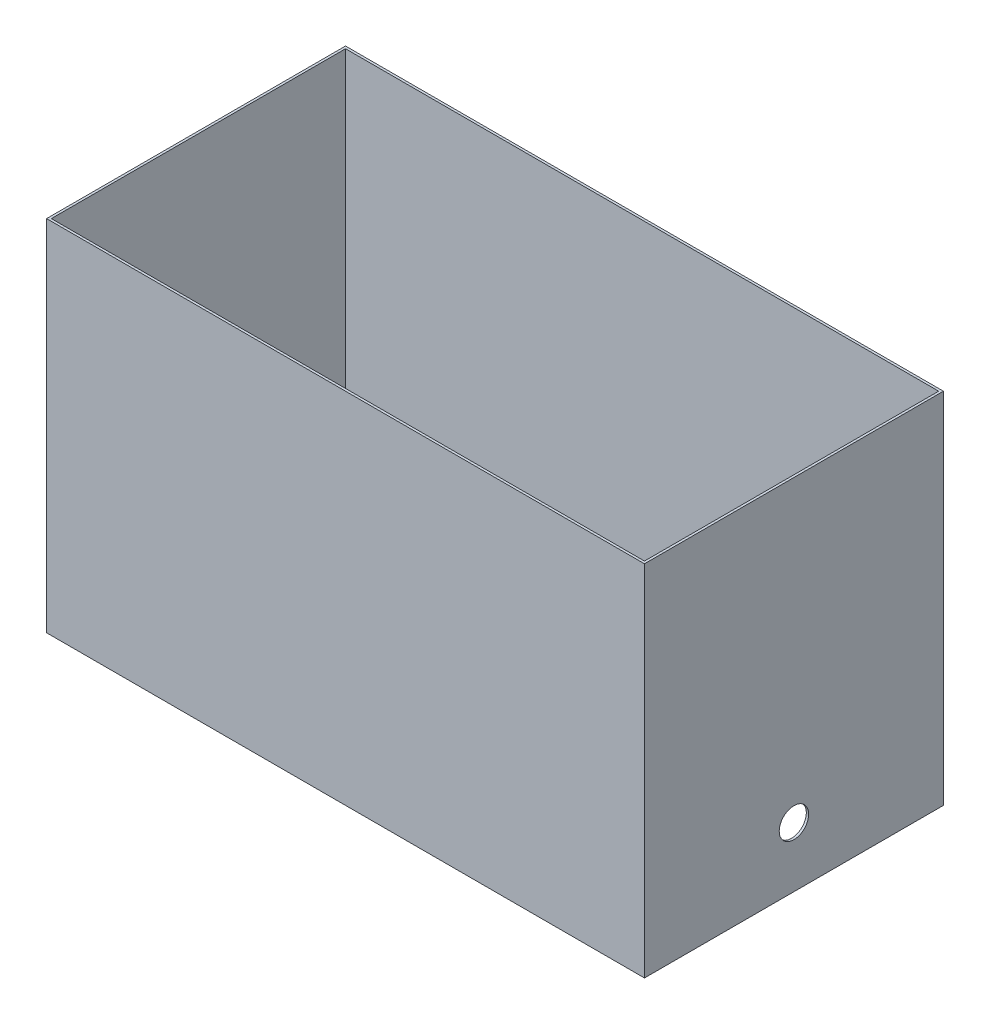
ISO-10303-21;
HEADER;
FILE_DESCRIPTION(('STEP AP214'),'2;1');
FILE_NAME('part.step','',(''),(''),'','','');
FILE_SCHEMA(('AUTOMOTIVE_DESIGN { 1 0 10303 214 1 1 1 1 }'));
ENDSEC;
DATA;
#1=APPLICATION_CONTEXT('core data for automotive mechanical design processes');
#2=APPLICATION_PROTOCOL_DEFINITION('international standard','automotive_design',2000,#1);
#3=PRODUCT_CONTEXT('',#1,'mechanical');
#4=PRODUCT('Part','Part','',(#3));
#5=PRODUCT_RELATED_PRODUCT_CATEGORY('part','',(#4));
#6=PRODUCT_DEFINITION_FORMATION('','',#4);
#7=PRODUCT_DEFINITION_CONTEXT('part definition',#1,'design');
#8=PRODUCT_DEFINITION('design','',#6,#7);
#9=PRODUCT_DEFINITION_SHAPE('','',#8);
#10=(LENGTH_UNIT() NAMED_UNIT(*) SI_UNIT(.MILLI.,.METRE.));
#11=(NAMED_UNIT(*) PLANE_ANGLE_UNIT() SI_UNIT($,.RADIAN.));
#12=(NAMED_UNIT(*) SI_UNIT($,.STERADIAN.) SOLID_ANGLE_UNIT());
#13=UNCERTAINTY_MEASURE_WITH_UNIT(LENGTH_MEASURE(1.E-05),#10,'distance_accuracy_value','');
#14=(GEOMETRIC_REPRESENTATION_CONTEXT(3) GLOBAL_UNCERTAINTY_ASSIGNED_CONTEXT((#13)) GLOBAL_UNIT_ASSIGNED_CONTEXT((#10,
#11,#12)) REPRESENTATION_CONTEXT('',''));
#15=CARTESIAN_POINT('',(0.,0.,0.));
#16=DIRECTION('',(0.,0.,1.));
#17=DIRECTION('',(1.,0.,0.));
#18=AXIS2_PLACEMENT_3D('',#15,#16,#17);
#19=CARTESIAN_POINT('',(0.,304.8,0.));
#20=DIRECTION('',(0.,-1.,0.));
#21=DIRECTION('',(0.,0.,-1.));
#22=AXIS2_PLACEMENT_3D('',#19,#20,#21);
#23=PLANE('',#22);
#24=DIRECTION('',(0.,0.,-1.));
#25=VECTOR('',#24,1.);
#26=CARTESIAN_POINT('',(254.,304.8,127.));
#27=LINE('',#26,#25);
#28=CARTESIAN_POINT('',(254.,304.8,127.));
#29=VERTEX_POINT('',#28);
#30=CARTESIAN_POINT('',(254.,304.8,-127.));
#31=VERTEX_POINT('',#30);
#32=EDGE_CURVE('E136',#29,#31,#27,.T.);
#33=ORIENTED_EDGE('',*,*,#32,.T.);
#34=DIRECTION('',(-1.,0.,0.));
#35=VECTOR('',#34,1.);
#36=CARTESIAN_POINT('',(-254.,304.8,-127.));
#37=LINE('',#36,#35);
#38=CARTESIAN_POINT('',(-254.,304.8,-127.));
#39=VERTEX_POINT('',#38);
#40=EDGE_CURVE('E139',#31,#39,#37,.T.);
#41=ORIENTED_EDGE('',*,*,#40,.T.);
#42=DIRECTION('',(0.,0.,1.));
#43=VECTOR('',#42,1.);
#44=CARTESIAN_POINT('',(-254.,304.8,127.));
#45=LINE('',#44,#43);
#46=CARTESIAN_POINT('',(-254.,304.8,127.));
#47=VERTEX_POINT('',#46);
#48=EDGE_CURVE('E142',#39,#47,#45,.T.);
#49=ORIENTED_EDGE('',*,*,#48,.T.);
#50=DIRECTION('',(1.,0.,0.));
#51=VECTOR('',#50,1.);
#52=CARTESIAN_POINT('',(-254.,304.8,127.));
#53=LINE('',#52,#51);
#54=EDGE_CURVE('E144',#47,#29,#53,.T.);
#55=ORIENTED_EDGE('',*,*,#54,.T.);
#56=EDGE_LOOP('',(#33,#41,#49,#55));
#57=FACE_BOUND('',#56,.T.);
#58=DIRECTION('',(0.,0.,1.));
#59=VECTOR('',#58,1.);
#60=CARTESIAN_POINT('',(-252.,304.8,125.));
#61=LINE('',#60,#59);
#62=CARTESIAN_POINT('',(-252.,304.8,-125.));
#63=VERTEX_POINT('',#62);
#64=CARTESIAN_POINT('',(-252.,304.8,125.));
#65=VERTEX_POINT('',#64);
#66=EDGE_CURVE('E98',#63,#65,#61,.T.);
#67=ORIENTED_EDGE('',*,*,#66,.F.);
#68=DIRECTION('',(-1.,0.,0.));
#69=VECTOR('',#68,1.);
#70=CARTESIAN_POINT('',(-252.,304.8,-125.));
#71=LINE('',#70,#69);
#72=CARTESIAN_POINT('',(252.,304.8,-125.));
#73=VERTEX_POINT('',#72);
#74=EDGE_CURVE('E120',#73,#63,#71,.T.);
#75=ORIENTED_EDGE('',*,*,#74,.F.);
#76=DIRECTION('',(0.,0.,-1.));
#77=VECTOR('',#76,1.);
#78=CARTESIAN_POINT('',(252.,304.8,125.));
#79=LINE('',#78,#77);
#80=CARTESIAN_POINT('',(252.,304.8,125.));
#81=VERTEX_POINT('',#80);
#82=EDGE_CURVE('E118',#81,#73,#79,.T.);
#83=ORIENTED_EDGE('',*,*,#82,.F.);
#84=DIRECTION('',(1.,0.,0.));
#85=VECTOR('',#84,1.);
#86=CARTESIAN_POINT('',(-252.,304.8,125.));
#87=LINE('',#86,#85);
#88=EDGE_CURVE('E106',#65,#81,#87,.T.);
#89=ORIENTED_EDGE('',*,*,#88,.F.);
#90=EDGE_LOOP('',(#67,#75,#83,#89));
#91=FACE_BOUND('',#90,.T.);
#92=ADVANCED_FACE('F32',(#57,#91),#23,.F.);
#93=CARTESIAN_POINT('',(0.,0.,0.));
#94=DIRECTION('',(0.,-1.,0.));
#95=DIRECTION('',(0.,0.,-1.));
#96=AXIS2_PLACEMENT_3D('',#93,#94,#95);
#97=PLANE('',#96);
#98=DIRECTION('',(0.,0.,-1.));
#99=VECTOR('',#98,1.);
#100=CARTESIAN_POINT('',(254.,0.,127.));
#101=LINE('',#100,#99);
#102=CARTESIAN_POINT('',(254.,0.,127.));
#103=VERTEX_POINT('',#102);
#104=CARTESIAN_POINT('',(254.,0.,-127.));
#105=VERTEX_POINT('',#104);
#106=EDGE_CURVE('E114',#103,#105,#101,.T.);
#107=ORIENTED_EDGE('',*,*,#106,.F.);
#108=DIRECTION('',(1.,0.,0.));
#109=VECTOR('',#108,1.);
#110=CARTESIAN_POINT('',(-254.,0.,127.));
#111=LINE('',#110,#109);
#112=CARTESIAN_POINT('',(-254.,0.,127.));
#113=VERTEX_POINT('',#112);
#114=EDGE_CURVE('E140',#113,#103,#111,.T.);
#115=ORIENTED_EDGE('',*,*,#114,.F.);
#116=DIRECTION('',(0.,0.,1.));
#117=VECTOR('',#116,1.);
#118=CARTESIAN_POINT('',(-254.,0.,127.));
#119=LINE('',#118,#117);
#120=CARTESIAN_POINT('',(-254.,0.,-127.));
#121=VERTEX_POINT('',#120);
#122=EDGE_CURVE('E151',#121,#113,#119,.T.);
#123=ORIENTED_EDGE('',*,*,#122,.F.);
#124=DIRECTION('',(-1.,0.,0.));
#125=VECTOR('',#124,1.);
#126=CARTESIAN_POINT('',(-254.,0.,-127.));
#127=LINE('',#126,#125);
#128=EDGE_CURVE('E149',#105,#121,#127,.T.);
#129=ORIENTED_EDGE('',*,*,#128,.F.);
#130=EDGE_LOOP('',(#107,#115,#123,#129));
#131=FACE_BOUND('',#130,.T.);
#132=DIRECTION('',(-1.,0.,0.));
#133=VECTOR('',#132,1.);
#134=CARTESIAN_POINT('',(-252.,0.,-125.));
#135=LINE('',#134,#133);
#136=CARTESIAN_POINT('',(252.,0.,-125.));
#137=VERTEX_POINT('',#136);
#138=CARTESIAN_POINT('',(-252.,0.,-125.));
#139=VERTEX_POINT('',#138);
#140=EDGE_CURVE('E107',#137,#139,#135,.T.);
#141=ORIENTED_EDGE('',*,*,#140,.T.);
#142=DIRECTION('',(0.,0.,1.));
#143=VECTOR('',#142,1.);
#144=CARTESIAN_POINT('',(-252.,0.,125.));
#145=LINE('',#144,#143);
#146=CARTESIAN_POINT('',(-252.,0.,125.));
#147=VERTEX_POINT('',#146);
#148=EDGE_CURVE('E56',#139,#147,#145,.T.);
#149=ORIENTED_EDGE('',*,*,#148,.T.);
#150=DIRECTION('',(1.,0.,0.));
#151=VECTOR('',#150,1.);
#152=CARTESIAN_POINT('',(-252.,0.,125.));
#153=LINE('',#152,#151);
#154=CARTESIAN_POINT('',(252.,0.,125.));
#155=VERTEX_POINT('',#154);
#156=EDGE_CURVE('E113',#147,#155,#153,.T.);
#157=ORIENTED_EDGE('',*,*,#156,.T.);
#158=DIRECTION('',(0.,0.,-1.));
#159=VECTOR('',#158,1.);
#160=CARTESIAN_POINT('',(252.,0.,125.));
#161=LINE('',#160,#159);
#162=EDGE_CURVE('E128',#155,#137,#161,.T.);
#163=ORIENTED_EDGE('',*,*,#162,.T.);
#164=EDGE_LOOP('',(#141,#149,#157,#163));
#165=FACE_BOUND('',#164,.T.);
#166=ADVANCED_FACE('F170',(#131,#165),#97,.T.);
#167=CARTESIAN_POINT('',(254.,304.8,127.));
#168=DIRECTION('',(-1.,0.,0.));
#169=DIRECTION('',(0.,0.,1.));
#170=AXIS2_PLACEMENT_3D('',#167,#168,#169);
#171=PLANE('',#170);
#172=CARTESIAN_POINT('',(254.,50.8,0.));
#173=DIRECTION('',(-1.,0.,0.));
#174=DIRECTION('',(0.,0.,1.));
#175=AXIS2_PLACEMENT_3D('',#172,#173,#174);
#176=CIRCLE('',#175,12.5);
#177=CARTESIAN_POINT('',(254.,50.8,12.5));
#178=VERTEX_POINT('',#177);
#179=EDGE_CURVE('E211',#178,#178,#176,.T.);
#180=ORIENTED_EDGE('',*,*,#179,.T.);
#181=EDGE_LOOP('',(#180));
#182=FACE_BOUND('',#181,.T.);
#183=ORIENTED_EDGE('',*,*,#106,.T.);
#184=DIRECTION('',(0.,-1.,0.));
#185=VECTOR('',#184,1.);
#186=CARTESIAN_POINT('',(254.,304.8,-127.));
#187=LINE('',#186,#185);
#188=EDGE_CURVE('E11',#31,#105,#187,.T.);
#189=ORIENTED_EDGE('',*,*,#188,.F.);
#190=ORIENTED_EDGE('',*,*,#32,.F.);
#191=DIRECTION('',(0.,-1.,0.));
#192=VECTOR('',#191,1.);
#193=CARTESIAN_POINT('',(254.,304.8,127.));
#194=LINE('',#193,#192);
#195=EDGE_CURVE('E146',#29,#103,#194,.T.);
#196=ORIENTED_EDGE('',*,*,#195,.T.);
#197=EDGE_LOOP('',(#183,#189,#190,#196));
#198=FACE_BOUND('',#197,.T.);
#199=ADVANCED_FACE('F34',(#182,#198),#171,.F.);
#200=CARTESIAN_POINT('',(-254.,304.8,-127.));
#201=DIRECTION('',(0.,0.,1.));
#202=DIRECTION('',(1.,0.,0.));
#203=AXIS2_PLACEMENT_3D('',#200,#201,#202);
#204=PLANE('',#203);
#205=ORIENTED_EDGE('',*,*,#128,.T.);
#206=DIRECTION('',(0.,-1.,0.));
#207=VECTOR('',#206,1.);
#208=CARTESIAN_POINT('',(-254.,304.8,-127.));
#209=LINE('',#208,#207);
#210=EDGE_CURVE('E41',#39,#121,#209,.T.);
#211=ORIENTED_EDGE('',*,*,#210,.F.);
#212=ORIENTED_EDGE('',*,*,#40,.F.);
#213=ORIENTED_EDGE('',*,*,#188,.T.);
#214=EDGE_LOOP('',(#205,#211,#212,#213));
#215=FACE_BOUND('',#214,.T.);
#216=ADVANCED_FACE('F180',(#215),#204,.F.);
#217=CARTESIAN_POINT('',(-254.,304.8,127.));
#218=DIRECTION('',(1.,0.,0.));
#219=DIRECTION('',(0.,0.,-1.));
#220=AXIS2_PLACEMENT_3D('',#217,#218,#219);
#221=PLANE('',#220);
#222=CARTESIAN_POINT('',(-254.,50.8,0.));
#223=DIRECTION('',(-1.,0.,0.));
#224=DIRECTION('',(0.,0.,1.));
#225=AXIS2_PLACEMENT_3D('',#222,#223,#224);
#226=CIRCLE('',#225,12.5);
#227=CARTESIAN_POINT('',(-254.,50.8,12.5));
#228=VERTEX_POINT('',#227);
#229=EDGE_CURVE('E213',#228,#228,#226,.T.);
#230=ORIENTED_EDGE('',*,*,#229,.F.);
#231=EDGE_LOOP('',(#230));
#232=FACE_BOUND('',#231,.T.);
#233=ORIENTED_EDGE('',*,*,#122,.T.);
#234=DIRECTION('',(0.,-1.,0.));
#235=VECTOR('',#234,1.);
#236=CARTESIAN_POINT('',(-254.,304.8,127.));
#237=LINE('',#236,#235);
#238=EDGE_CURVE('E156',#47,#113,#237,.T.);
#239=ORIENTED_EDGE('',*,*,#238,.F.);
#240=ORIENTED_EDGE('',*,*,#48,.F.);
#241=ORIENTED_EDGE('',*,*,#210,.T.);
#242=EDGE_LOOP('',(#233,#239,#240,#241));
#243=FACE_BOUND('',#242,.T.);
#244=ADVANCED_FACE('F164',(#232,#243),#221,.F.);
#245=CARTESIAN_POINT('',(-254.,304.8,127.));
#246=DIRECTION('',(0.,0.,-1.));
#247=DIRECTION('',(-1.,0.,0.));
#248=AXIS2_PLACEMENT_3D('',#245,#246,#247);
#249=PLANE('',#248);
#250=ORIENTED_EDGE('',*,*,#114,.T.);
#251=ORIENTED_EDGE('',*,*,#195,.F.);
#252=ORIENTED_EDGE('',*,*,#54,.F.);
#253=ORIENTED_EDGE('',*,*,#238,.T.);
#254=EDGE_LOOP('',(#250,#251,#252,#253));
#255=FACE_BOUND('',#254,.T.);
#256=ADVANCED_FACE('F174',(#255),#249,.F.);
#257=CARTESIAN_POINT('',(-252.,304.8,125.));
#258=DIRECTION('',(1.,0.,0.));
#259=DIRECTION('',(0.,0.,-1.));
#260=AXIS2_PLACEMENT_3D('',#257,#258,#259);
#261=PLANE('',#260);
#262=CARTESIAN_POINT('',(-252.,50.8,0.));
#263=DIRECTION('',(1.,0.,0.));
#264=DIRECTION('',(0.,0.,-1.));
#265=AXIS2_PLACEMENT_3D('',#262,#263,#264);
#266=CIRCLE('',#265,12.5);
#267=CARTESIAN_POINT('',(-252.,50.8,-12.5));
#268=VERTEX_POINT('',#267);
#269=EDGE_CURVE('E126',#268,#268,#266,.T.);
#270=ORIENTED_EDGE('',*,*,#269,.F.);
#271=EDGE_LOOP('',(#270));
#272=FACE_BOUND('',#271,.T.);
#273=ORIENTED_EDGE('',*,*,#148,.F.);
#274=DIRECTION('',(0.,-1.,0.));
#275=VECTOR('',#274,1.);
#276=CARTESIAN_POINT('',(-252.,304.8,-125.));
#277=LINE('',#276,#275);
#278=EDGE_CURVE('E102',#63,#139,#277,.T.);
#279=ORIENTED_EDGE('',*,*,#278,.F.);
#280=ORIENTED_EDGE('',*,*,#66,.T.);
#281=DIRECTION('',(0.,-1.,0.));
#282=VECTOR('',#281,1.);
#283=CARTESIAN_POINT('',(-252.,304.8,125.));
#284=LINE('',#283,#282);
#285=EDGE_CURVE('E101',#65,#147,#284,.T.);
#286=ORIENTED_EDGE('',*,*,#285,.T.);
#287=EDGE_LOOP('',(#273,#279,#280,#286));
#288=FACE_BOUND('',#287,.T.);
#289=ADVANCED_FACE('F100',(#272,#288),#261,.T.);
#290=CARTESIAN_POINT('',(-252.,304.8,125.));
#291=DIRECTION('',(0.,0.,-1.));
#292=DIRECTION('',(-1.,0.,0.));
#293=AXIS2_PLACEMENT_3D('',#290,#291,#292);
#294=PLANE('',#293);
#295=ORIENTED_EDGE('',*,*,#156,.F.);
#296=ORIENTED_EDGE('',*,*,#285,.F.);
#297=ORIENTED_EDGE('',*,*,#88,.T.);
#298=DIRECTION('',(0.,-1.,0.));
#299=VECTOR('',#298,1.);
#300=CARTESIAN_POINT('',(252.,304.8,125.));
#301=LINE('',#300,#299);
#302=EDGE_CURVE('E115',#81,#155,#301,.T.);
#303=ORIENTED_EDGE('',*,*,#302,.T.);
#304=EDGE_LOOP('',(#295,#296,#297,#303));
#305=FACE_BOUND('',#304,.T.);
#306=ADVANCED_FACE('F110',(#305),#294,.T.);
#307=CARTESIAN_POINT('',(252.,304.8,125.));
#308=DIRECTION('',(-1.,0.,0.));
#309=DIRECTION('',(0.,0.,1.));
#310=AXIS2_PLACEMENT_3D('',#307,#308,#309);
#311=PLANE('',#310);
#312=CARTESIAN_POINT('',(252.,50.8,0.));
#313=DIRECTION('',(-1.,0.,0.));
#314=DIRECTION('',(0.,0.,1.));
#315=AXIS2_PLACEMENT_3D('',#312,#313,#314);
#316=CIRCLE('',#315,12.5);
#317=CARTESIAN_POINT('',(252.,50.8,12.5));
#318=VERTEX_POINT('',#317);
#319=EDGE_CURVE('E36',#318,#318,#316,.T.);
#320=ORIENTED_EDGE('',*,*,#319,.F.);
#321=EDGE_LOOP('',(#320));
#322=FACE_BOUND('',#321,.T.);
#323=ORIENTED_EDGE('',*,*,#162,.F.);
#324=ORIENTED_EDGE('',*,*,#302,.F.);
#325=ORIENTED_EDGE('',*,*,#82,.T.);
#326=DIRECTION('',(0.,-1.,0.));
#327=VECTOR('',#326,1.);
#328=CARTESIAN_POINT('',(252.,304.8,-125.));
#329=LINE('',#328,#327);
#330=EDGE_CURVE('E48',#73,#137,#329,.T.);
#331=ORIENTED_EDGE('',*,*,#330,.T.);
#332=EDGE_LOOP('',(#323,#324,#325,#331));
#333=FACE_BOUND('',#332,.T.);
#334=ADVANCED_FACE('F206',(#322,#333),#311,.T.);
#335=CARTESIAN_POINT('',(-252.,304.8,-125.));
#336=DIRECTION('',(0.,0.,1.));
#337=DIRECTION('',(1.,0.,0.));
#338=AXIS2_PLACEMENT_3D('',#335,#336,#337);
#339=PLANE('',#338);
#340=ORIENTED_EDGE('',*,*,#140,.F.);
#341=ORIENTED_EDGE('',*,*,#330,.F.);
#342=ORIENTED_EDGE('',*,*,#74,.T.);
#343=ORIENTED_EDGE('',*,*,#278,.T.);
#344=EDGE_LOOP('',(#340,#341,#342,#343));
#345=FACE_BOUND('',#344,.T.);
#346=ADVANCED_FACE('F222',(#345),#339,.T.);
#347=CARTESIAN_POINT('',(254.,50.8,0.));
#348=DIRECTION('',(-1.,0.,0.));
#349=DIRECTION('',(0.,0.,1.));
#350=AXIS2_PLACEMENT_3D('',#347,#348,#349);
#351=CYLINDRICAL_SURFACE('',#350,12.5);
#352=ORIENTED_EDGE('',*,*,#319,.T.);
#353=EDGE_LOOP('',(#352));
#354=FACE_BOUND('',#353,.T.);
#355=ORIENTED_EDGE('',*,*,#179,.F.);
#356=EDGE_LOOP('',(#355));
#357=FACE_BOUND('',#356,.T.);
#358=ADVANCED_FACE('F219',(#354,#357),#351,.F.);
#359=ORIENTED_EDGE('',*,*,#269,.T.);
#360=EDGE_LOOP('',(#359));
#361=FACE_BOUND('',#360,.T.);
#362=ORIENTED_EDGE('',*,*,#229,.T.);
#363=EDGE_LOOP('',(#362));
#364=FACE_BOUND('',#363,.T.);
#365=ADVANCED_FACE('F221',(#361,#364),#351,.F.);
#366=CLOSED_SHELL('',(#92,#166,#199,#216,#244,#256,#289,#306,#334,#346,#358,#365));
#367=MANIFOLD_SOLID_BREP('B2',#366);
#368=ADVANCED_BREP_SHAPE_REPRESENTATION('',(#18,#367),#14);
#369=SHAPE_DEFINITION_REPRESENTATION(#9,#368);
ENDSEC;
END-ISO-10303-21;
